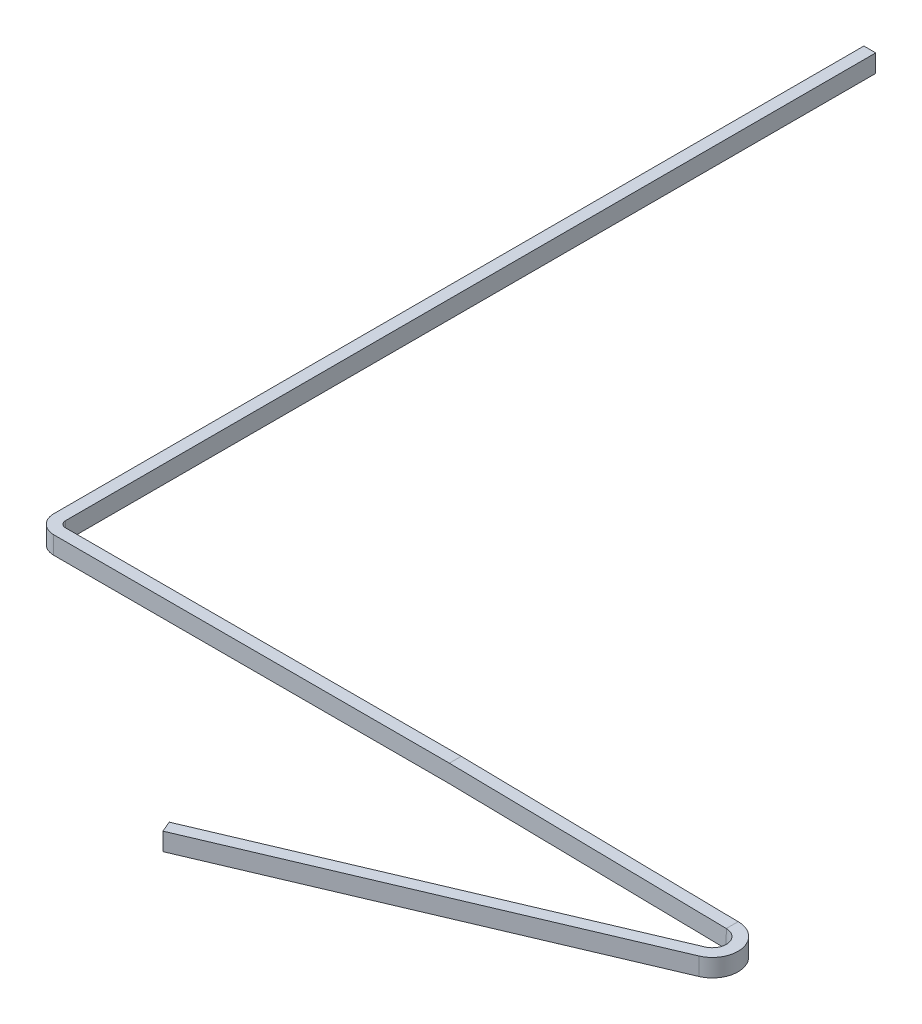
ISO-10303-21;
HEADER;
FILE_DESCRIPTION(('STEP AP214'),'2;1');
FILE_NAME('part.step','',(''),(''),'','','');
FILE_SCHEMA(('AUTOMOTIVE_DESIGN { 1 0 10303 214 1 1 1 1 }'));
ENDSEC;
DATA;
#1=APPLICATION_CONTEXT('core data for automotive mechanical design processes');
#2=APPLICATION_PROTOCOL_DEFINITION('international standard','automotive_design',2000,#1);
#3=PRODUCT_CONTEXT('',#1,'mechanical');
#4=PRODUCT('Part','Part','',(#3));
#5=PRODUCT_RELATED_PRODUCT_CATEGORY('part','',(#4));
#6=PRODUCT_DEFINITION_FORMATION('','',#4);
#7=PRODUCT_DEFINITION_CONTEXT('part definition',#1,'design');
#8=PRODUCT_DEFINITION('design','',#6,#7);
#9=PRODUCT_DEFINITION_SHAPE('','',#8);
#10=(LENGTH_UNIT() NAMED_UNIT(*) SI_UNIT(.MILLI.,.METRE.));
#11=(NAMED_UNIT(*) PLANE_ANGLE_UNIT() SI_UNIT($,.RADIAN.));
#12=(NAMED_UNIT(*) SI_UNIT($,.STERADIAN.) SOLID_ANGLE_UNIT());
#13=UNCERTAINTY_MEASURE_WITH_UNIT(LENGTH_MEASURE(1.E-05),#10,'distance_accuracy_value','');
#14=(GEOMETRIC_REPRESENTATION_CONTEXT(3) GLOBAL_UNCERTAINTY_ASSIGNED_CONTEXT((#13)) GLOBAL_UNIT_ASSIGNED_CONTEXT((#10,
#11,#12)) REPRESENTATION_CONTEXT('',''));
#15=CARTESIAN_POINT('',(0.,0.,0.));
#16=DIRECTION('',(0.,0.,1.));
#17=DIRECTION('',(1.,0.,0.));
#18=AXIS2_PLACEMENT_3D('',#15,#16,#17);
#19=CARTESIAN_POINT('',(0.31,0.225,20.94));
#20=DIRECTION('',(0.,0.,1.));
#21=DIRECTION('',(0.,-1.,0.));
#22=AXIS2_PLACEMENT_3D('',#19,#20,#21);
#23=PLANE('',#22);
#24=DIRECTION('',(1.,0.,0.));
#25=VECTOR('',#24,1.);
#26=CARTESIAN_POINT('',(5.08096421487921,0.225,20.94));
#27=LINE('',#26,#25);
#28=CARTESIAN_POINT('',(0.310000000000003,0.225,20.94));
#29=VERTEX_POINT('',#28);
#30=CARTESIAN_POINT('',(10.3119284297584,0.225,20.94));
#31=VERTEX_POINT('',#30);
#32=EDGE_CURVE('E129',#29,#31,#27,.T.);
#33=ORIENTED_EDGE('',*,*,#32,.F.);
#34=DIRECTION('',(0.,1.,0.));
#35=VECTOR('',#34,1.);
#36=CARTESIAN_POINT('',(0.31,0.,20.94));
#37=LINE('',#36,#35);
#38=CARTESIAN_POINT('',(0.310000000000003,-0.225,20.94));
#39=VERTEX_POINT('',#38);
#40=EDGE_CURVE('E339',#39,#29,#37,.T.);
#41=ORIENTED_EDGE('',*,*,#40,.F.);
#42=DIRECTION('',(-1.,0.,0.));
#43=VECTOR('',#42,1.);
#44=CARTESIAN_POINT('',(5.07903578512079,-0.225,20.94));
#45=LINE('',#44,#43);
#46=CARTESIAN_POINT('',(10.3080715702416,-0.225,20.94));
#47=VERTEX_POINT('',#46);
#48=EDGE_CURVE('E279',#47,#39,#45,.T.);
#49=ORIENTED_EDGE('',*,*,#48,.F.);
#50=DIRECTION('',(-0.999853093603066,0.017140338747481,0.));
#51=VECTOR('',#50,1.);
#52=CARTESIAN_POINT('',(13.8080715702416,-0.285,20.94));
#53=LINE('',#52,#51);
#54=CARTESIAN_POINT('',(17.3080715702661,-0.345,20.9399998717641));
#55=VERTEX_POINT('',#54);
#56=EDGE_CURVE('E147',#55,#47,#53,.T.);
#57=ORIENTED_EDGE('',*,*,#56,.F.);
#58=CARTESIAN_POINT('',(17.3119284105971,0.105,20.9400044651815));
#59=CARTESIAN_POINT('',(17.3117743537489,0.0862499943933692,20.9400038030493));
#60=CARTESIAN_POINT('',(17.3116196248195,0.0674999943004711,20.94000321523));
#61=CARTESIAN_POINT('',(17.3113087689158,0.0299999941146675,20.9400021849687));
#62=CARTESIAN_POINT('',(17.3111526419406,0.0112499940217692,20.9400017425267));
#63=CARTESIAN_POINT('',(17.310838936153,-0.0262500059571002,20.9400009997715));
#64=CARTESIAN_POINT('',(17.3106813573398,-0.0450000058430635,20.9400006994584));
#65=CARTESIAN_POINT('',(17.3103648417196,-0.0825000064493991,20.9400002568678));
#66=CARTESIAN_POINT('',(17.3102059049117,-0.101250007169764,20.9400001145904));
#67=CARTESIAN_POINT('',(17.3098861765729,-0.138750009075973,20.9399999273576));
#68=CARTESIAN_POINT('',(17.3097253850402,-0.157500010261803,20.9399998824023));
#69=CARTESIAN_POINT('',(17.3094011525863,-0.195000011056235,20.9399997749199));
#70=CARTESIAN_POINT('',(17.309237711662,-0.21375001066481,20.9399997123928));
#71=CARTESIAN_POINT('',(17.3089084907849,-0.251250010257553,20.9399995987342));
#72=CARTESIAN_POINT('',(17.3087427108295,-0.270000010241698,20.9399995476026));
#73=CARTESIAN_POINT('',(17.3084088533579,-0.307500010210011,20.9399994507));
#74=CARTESIAN_POINT('',(17.3082407758391,-0.326250010194157,20.939999404929));
#75=CARTESIAN_POINT('',(17.3080715703642,-0.344999999999597,20.9399993588207));
#76=B_SPLINE_CURVE_WITH_KNOTS('',3,(#58,#59,#60,#61,#62,#63,#64,#65,#66,#67,#68,#69,#70,#71,#72,
#73,#74,#75),.UNSPECIFIED.,.F.,.F.,(4,2,2,2,2,2,2,2,4),(0.,0.0562519155002906,0.112503865756662,
0.168755851820885,0.225007874764717,0.281259946448741,0.337512082090783,0.393764280504147,
0.45001654027719),.UNSPECIFIED.);
#77=CARTESIAN_POINT('',(17.3119284239541,0.105,20.940002383193));
#78=VERTEX_POINT('',#77);
#79=EDGE_CURVE('E119',#55,#78,#76,.F.);
#80=ORIENTED_EDGE('',*,*,#79,.T.);
#81=DIRECTION('',(0.999853093603066,-0.017140338747481,0.));
#82=VECTOR('',#81,1.);
#83=CARTESIAN_POINT('',(13.8119284297584,0.165,20.94));
#84=LINE('',#83,#82);
#85=EDGE_CURVE('E148',#31,#78,#84,.T.);
#86=ORIENTED_EDGE('',*,*,#85,.F.);
#87=EDGE_LOOP('',(#33,#41,#49,#57,#80,#86));
#88=FACE_BOUND('',#87,.T.);
#89=ADVANCED_FACE('F15',(#88),#23,.T.);
#90=CARTESIAN_POINT('',(0.310000000000006,-0.27,20.48));
#91=DIRECTION('',(0.,1.,0.));
#92=DIRECTION('',(0.,0.,1.));
#93=AXIS2_PLACEMENT_3D('',#90,#91,#92);
#94=CYLINDRICAL_SURFACE('',#93,0.460000000000002);
#95=CARTESIAN_POINT('',(0.310000000000006,0.225,20.48));
#96=DIRECTION('',(0.,1.,0.));
#97=DIRECTION('',(0.,0.,1.));
#98=AXIS2_PLACEMENT_3D('',#95,#96,#97);
#99=CIRCLE('',#98,0.460000000000002);
#100=CARTESIAN_POINT('',(-0.15,0.225,20.48));
#101=VERTEX_POINT('',#100);
#102=EDGE_CURVE('E19',#101,#29,#99,.T.);
#103=ORIENTED_EDGE('',*,*,#102,.F.);
#104=DIRECTION('',(0.,1.,0.));
#105=VECTOR('',#104,1.);
#106=CARTESIAN_POINT('',(-0.15,0.,20.48));
#107=LINE('',#106,#105);
#108=CARTESIAN_POINT('',(-0.15,-0.225,20.48));
#109=VERTEX_POINT('',#108);
#110=EDGE_CURVE('E96',#109,#101,#107,.T.);
#111=ORIENTED_EDGE('',*,*,#110,.F.);
#112=CARTESIAN_POINT('',(0.310000000000006,-0.225,20.48));
#113=DIRECTION('',(0.,1.,0.));
#114=DIRECTION('',(0.,0.,1.));
#115=AXIS2_PLACEMENT_3D('',#112,#113,#114);
#116=CIRCLE('',#115,0.460000000000002);
#117=EDGE_CURVE('E276',#39,#109,#116,.F.);
#118=ORIENTED_EDGE('',*,*,#117,.F.);
#119=ORIENTED_EDGE('',*,*,#40,.T.);
#120=EDGE_LOOP('',(#103,#111,#118,#119));
#121=FACE_BOUND('',#120,.T.);
#122=ADVANCED_FACE('F364',(#121),#94,.T.);
#123=CARTESIAN_POINT('',(-0.15,0.225,0.));
#124=DIRECTION('',(-1.,0.,0.));
#125=DIRECTION('',(0.,-1.,0.));
#126=AXIS2_PLACEMENT_3D('',#123,#124,#125);
#127=PLANE('',#126);
#128=DIRECTION('',(0.,0.,1.));
#129=VECTOR('',#128,1.);
#130=CARTESIAN_POINT('',(-0.15,0.225,10.47));
#131=LINE('',#130,#129);
#132=CARTESIAN_POINT('',(-0.15,0.225,0.));
#133=VERTEX_POINT('',#132);
#134=EDGE_CURVE('E311',#133,#101,#131,.T.);
#135=ORIENTED_EDGE('',*,*,#134,.F.);
#136=DIRECTION('',(0.,1.,0.));
#137=VECTOR('',#136,1.);
#138=CARTESIAN_POINT('',(-0.15,0.,0.));
#139=LINE('',#138,#137);
#140=CARTESIAN_POINT('',(-0.15,-0.225,0.));
#141=VERTEX_POINT('',#140);
#142=EDGE_CURVE('E108',#141,#133,#139,.T.);
#143=ORIENTED_EDGE('',*,*,#142,.F.);
#144=DIRECTION('',(0.,0.,-1.));
#145=VECTOR('',#144,1.);
#146=CARTESIAN_POINT('',(-0.15,-0.225,10.47));
#147=LINE('',#146,#145);
#148=EDGE_CURVE('E278',#109,#141,#147,.T.);
#149=ORIENTED_EDGE('',*,*,#148,.F.);
#150=ORIENTED_EDGE('',*,*,#110,.T.);
#151=EDGE_LOOP('',(#135,#143,#149,#150));
#152=FACE_BOUND('',#151,.T.);
#153=ADVANCED_FACE('F367',(#152),#127,.T.);
#154=CARTESIAN_POINT('',(0.15,-0.225,0.));
#155=DIRECTION('',(0.,0.,-1.));
#156=DIRECTION('',(-1.,0.,0.));
#157=AXIS2_PLACEMENT_3D('',#154,#155,#156);
#158=PLANE('',#157);
#159=ORIENTED_EDGE('',*,*,#142,.T.);
#160=DIRECTION('',(-1.,0.,0.));
#161=VECTOR('',#160,1.);
#162=CARTESIAN_POINT('',(5.08096421487921,0.225,0.));
#163=LINE('',#162,#161);
#164=CARTESIAN_POINT('',(0.150000000000008,0.225,0.));
#165=VERTEX_POINT('',#164);
#166=EDGE_CURVE('E314',#165,#133,#163,.T.);
#167=ORIENTED_EDGE('',*,*,#166,.F.);
#168=DIRECTION('',(0.,1.,0.));
#169=VECTOR('',#168,1.);
#170=CARTESIAN_POINT('',(0.15,0.,0.));
#171=LINE('',#170,#169);
#172=CARTESIAN_POINT('',(0.149999999999974,-0.225,0.));
#173=VERTEX_POINT('',#172);
#174=EDGE_CURVE('E323',#173,#165,#171,.T.);
#175=ORIENTED_EDGE('',*,*,#174,.F.);
#176=DIRECTION('',(1.,0.,0.));
#177=VECTOR('',#176,1.);
#178=CARTESIAN_POINT('',(5.07903578512079,-0.225,0.));
#179=LINE('',#178,#177);
#180=EDGE_CURVE('E284',#141,#173,#179,.T.);
#181=ORIENTED_EDGE('',*,*,#180,.F.);
#182=EDGE_LOOP('',(#159,#167,#175,#181));
#183=FACE_BOUND('',#182,.T.);
#184=ADVANCED_FACE('F371',(#183),#158,.T.);
#185=CARTESIAN_POINT('',(0.15,-0.225,0.));
#186=DIRECTION('',(1.,0.,0.));
#187=DIRECTION('',(0.,1.,0.));
#188=AXIS2_PLACEMENT_3D('',#185,#186,#187);
#189=PLANE('',#188);
#190=ORIENTED_EDGE('',*,*,#174,.T.);
#191=DIRECTION('',(0.,0.,-1.));
#192=VECTOR('',#191,1.);
#193=CARTESIAN_POINT('',(0.150000000000012,0.225,10.47));
#194=LINE('',#193,#192);
#195=CARTESIAN_POINT('',(0.150000000000006,0.225,20.48));
#196=VERTEX_POINT('',#195);
#197=EDGE_CURVE('E317',#196,#165,#194,.T.);
#198=ORIENTED_EDGE('',*,*,#197,.F.);
#199=DIRECTION('',(0.,-1.,0.));
#200=VECTOR('',#199,1.);
#201=CARTESIAN_POINT('',(0.15,0.,20.48));
#202=LINE('',#201,#200);
#203=CARTESIAN_POINT('',(0.149999999999981,-0.225,20.48));
#204=VERTEX_POINT('',#203);
#205=EDGE_CURVE('E326',#196,#204,#202,.T.);
#206=ORIENTED_EDGE('',*,*,#205,.T.);
#207=DIRECTION('',(0.,0.,1.));
#208=VECTOR('',#207,1.);
#209=CARTESIAN_POINT('',(0.149999999999962,-0.225,10.47));
#210=LINE('',#209,#208);
#211=EDGE_CURVE('E275',#173,#204,#210,.T.);
#212=ORIENTED_EDGE('',*,*,#211,.F.);
#213=EDGE_LOOP('',(#190,#198,#206,#212));
#214=FACE_BOUND('',#213,.T.);
#215=ADVANCED_FACE('F374',(#214),#189,.T.);
#216=CARTESIAN_POINT('',(-0.15,0.225,0.));
#217=DIRECTION('',(0.,1.,0.));
#218=DIRECTION('',(0.,0.,1.));
#219=AXIS2_PLACEMENT_3D('',#216,#217,#218);
#220=PLANE('',#219);
#221=ORIENTED_EDGE('',*,*,#134,.T.);
#222=ORIENTED_EDGE('',*,*,#102,.T.);
#223=ORIENTED_EDGE('',*,*,#32,.T.);
#224=DIRECTION('',(0.,0.,1.));
#225=VECTOR('',#224,1.);
#226=CARTESIAN_POINT('',(10.3119284297584,0.225,20.79));
#227=LINE('',#226,#225);
#228=CARTESIAN_POINT('',(10.3119284297584,0.225,20.64));
#229=VERTEX_POINT('',#228);
#230=EDGE_CURVE('E303',#229,#31,#227,.T.);
#231=ORIENTED_EDGE('',*,*,#230,.F.);
#232=DIRECTION('',(1.,0.,0.));
#233=VECTOR('',#232,1.);
#234=CARTESIAN_POINT('',(8.81096421487923,0.225,20.64));
#235=LINE('',#234,#233);
#236=CARTESIAN_POINT('',(0.31,0.225,20.64));
#237=VERTEX_POINT('',#236);
#238=EDGE_CURVE('E267',#237,#229,#235,.T.);
#239=ORIENTED_EDGE('',*,*,#238,.F.);
#240=CARTESIAN_POINT('',(0.31,0.225,20.48));
#241=DIRECTION('',(0.,1.,0.));
#242=DIRECTION('',(0.,0.,1.));
#243=AXIS2_PLACEMENT_3D('',#240,#241,#242);
#244=CIRCLE('',#243,0.160000000000002);
#245=EDGE_CURVE('E270',#196,#237,#244,.T.);
#246=ORIENTED_EDGE('',*,*,#245,.F.);
#247=ORIENTED_EDGE('',*,*,#197,.T.);
#248=ORIENTED_EDGE('',*,*,#166,.T.);
#249=EDGE_LOOP('',(#221,#222,#223,#231,#239,#246,#247,#248));
#250=FACE_BOUND('',#249,.T.);
#251=ADVANCED_FACE('F377',(#250),#220,.T.);
#252=CARTESIAN_POINT('',(17.3119284297585,0.105,20.64));
#253=DIRECTION('',(0.017140338747481,0.999853093603066,0.));
#254=DIRECTION('',(-0.999853093603066,0.017140338747481,0.));
#255=AXIS2_PLACEMENT_3D('',#252,#253,#254);
#256=PLANE('',#255);
#257=ORIENTED_EDGE('',*,*,#230,.T.);
#258=ORIENTED_EDGE('',*,*,#85,.T.);
#259=DIRECTION('',(0.,0.,-1.));
#260=VECTOR('',#259,1.);
#261=CARTESIAN_POINT('',(17.3119284297585,0.105,20.79));
#262=LINE('',#261,#260);
#263=CARTESIAN_POINT('',(17.3119284213291,0.105000000000001,20.6400021728676));
#264=VERTEX_POINT('',#263);
#265=EDGE_CURVE('E301',#78,#264,#262,.T.);
#266=ORIENTED_EDGE('',*,*,#265,.T.);
#267=DIRECTION('',(0.999853093603066,-0.0171403387474805,0.));
#268=VECTOR('',#267,1.);
#269=CARTESIAN_POINT('',(10.3119284297583,0.225,20.64));
#270=LINE('',#269,#268);
#271=EDGE_CURVE('E160',#229,#264,#270,.T.);
#272=ORIENTED_EDGE('',*,*,#271,.F.);
#273=EDGE_LOOP('',(#257,#258,#266,#272));
#274=FACE_BOUND('',#273,.T.);
#275=ADVANCED_FACE('F381',(#274),#256,.T.);
#276=CARTESIAN_POINT('',(10.3080715702416,-0.225,20.64));
#277=DIRECTION('',(-0.017140338747481,-0.999853093603066,0.));
#278=DIRECTION('',(0.999853093603066,-0.017140338747481,0.));
#279=AXIS2_PLACEMENT_3D('',#276,#277,#278);
#280=PLANE('',#279);
#281=ORIENTED_EDGE('',*,*,#56,.T.);
#282=DIRECTION('',(0.,0.,1.));
#283=VECTOR('',#282,1.);
#284=CARTESIAN_POINT('',(10.3080715702416,-0.225,10.47));
#285=LINE('',#284,#283);
#286=CARTESIAN_POINT('',(10.3080715702426,-0.22500000000001,20.64));
#287=VERTEX_POINT('',#286);
#288=EDGE_CURVE('E155',#287,#47,#285,.T.);
#289=ORIENTED_EDGE('',*,*,#288,.F.);
#290=DIRECTION('',(-0.999853093603066,0.017140338747481,0.));
#291=VECTOR('',#290,1.);
#292=CARTESIAN_POINT('',(17.3080715702416,-0.345,20.64));
#293=LINE('',#292,#291);
#294=CARTESIAN_POINT('',(17.3080715703353,-0.345,20.639999807439));
#295=VERTEX_POINT('',#294);
#296=EDGE_CURVE('E151',#295,#287,#293,.T.);
#297=ORIENTED_EDGE('',*,*,#296,.F.);
#298=DIRECTION('',(0.,0.,1.));
#299=VECTOR('',#298,1.);
#300=CARTESIAN_POINT('',(17.3080715702416,-0.345,20.79));
#301=LINE('',#300,#299);
#302=EDGE_CURVE('E138',#295,#55,#301,.T.);
#303=ORIENTED_EDGE('',*,*,#302,.T.);
#304=EDGE_LOOP('',(#281,#289,#297,#303));
#305=FACE_BOUND('',#304,.T.);
#306=ADVANCED_FACE('F153',(#305),#280,.T.);
#307=CARTESIAN_POINT('',(-0.15,-0.225,20.94));
#308=DIRECTION('',(0.,-1.,0.));
#309=DIRECTION('',(0.,0.,-1.));
#310=AXIS2_PLACEMENT_3D('',#307,#308,#309);
#311=PLANE('',#310);
#312=ORIENTED_EDGE('',*,*,#211,.T.);
#313=CARTESIAN_POINT('',(0.31,-0.225,20.48));
#314=DIRECTION('',(0.,1.,0.));
#315=DIRECTION('',(0.,0.,1.));
#316=AXIS2_PLACEMENT_3D('',#313,#314,#315);
#317=CIRCLE('',#316,0.160000000000002);
#318=CARTESIAN_POINT('',(0.31,-0.225000000000001,20.64));
#319=VERTEX_POINT('',#318);
#320=EDGE_CURVE('E273',#319,#204,#317,.F.);
#321=ORIENTED_EDGE('',*,*,#320,.F.);
#322=DIRECTION('',(-1.,0.,0.));
#323=VECTOR('',#322,1.);
#324=CARTESIAN_POINT('',(8.81096421487923,-0.225000000000002,20.64));
#325=LINE('',#324,#323);
#326=EDGE_CURVE('E159',#287,#319,#325,.T.);
#327=ORIENTED_EDGE('',*,*,#326,.F.);
#328=ORIENTED_EDGE('',*,*,#288,.T.);
#329=ORIENTED_EDGE('',*,*,#48,.T.);
#330=ORIENTED_EDGE('',*,*,#117,.T.);
#331=ORIENTED_EDGE('',*,*,#148,.T.);
#332=ORIENTED_EDGE('',*,*,#180,.T.);
#333=EDGE_LOOP('',(#312,#321,#327,#328,#329,#330,#331,#332));
#334=FACE_BOUND('',#333,.T.);
#335=ADVANCED_FACE('F387',(#334),#311,.T.);
#336=CARTESIAN_POINT('',(0.31,-0.27,20.48));
#337=DIRECTION('',(0.,1.,0.));
#338=DIRECTION('',(0.,0.,1.));
#339=AXIS2_PLACEMENT_3D('',#336,#337,#338);
#340=CYLINDRICAL_SURFACE('',#339,0.160000000000002);
#341=ORIENTED_EDGE('',*,*,#205,.F.);
#342=ORIENTED_EDGE('',*,*,#245,.T.);
#343=DIRECTION('',(0.,1.,0.));
#344=VECTOR('',#343,1.);
#345=CARTESIAN_POINT('',(0.31,-0.06,20.64));
#346=LINE('',#345,#344);
#347=EDGE_CURVE('E262',#319,#237,#346,.T.);
#348=ORIENTED_EDGE('',*,*,#347,.F.);
#349=ORIENTED_EDGE('',*,*,#320,.T.);
#350=EDGE_LOOP('',(#341,#342,#348,#349));
#351=FACE_BOUND('',#350,.T.);
#352=ADVANCED_FACE('F389',(#351),#340,.F.);
#353=CARTESIAN_POINT('',(0.31,-0.345,20.64));
#354=DIRECTION('',(0.,0.,-1.));
#355=DIRECTION('',(0.,1.,0.));
#356=AXIS2_PLACEMENT_3D('',#353,#354,#355);
#357=PLANE('',#356);
#358=ORIENTED_EDGE('',*,*,#326,.T.);
#359=ORIENTED_EDGE('',*,*,#347,.T.);
#360=ORIENTED_EDGE('',*,*,#238,.T.);
#361=ORIENTED_EDGE('',*,*,#271,.T.);
#362=CARTESIAN_POINT('',(17.30807157071,-0.345000000000424,20.6399990371949));
#363=CARTESIAN_POINT('',(17.3082274375949,-0.326249994605904,20.6399991060643));
#364=CARTESIAN_POINT('',(17.3083839483517,-0.30749999456338,20.6399991757276));
#365=CARTESIAN_POINT('',(17.3086982773589,-0.269999994478325,20.6399993207202));
#366=CARTESIAN_POINT('',(17.30885609561,-0.2512499944358,20.6399993960496));
#367=CARTESIAN_POINT('',(17.3091730592695,-0.213749994211016,20.6399995564527));
#368=CARTESIAN_POINT('',(17.3093322046787,-0.194999994028763,20.6399996415264));
#369=CARTESIAN_POINT('',(17.3096519389818,-0.157499994215478,20.6399998019571));
#370=CARTESIAN_POINT('',(17.3098125278766,-0.138749994584453,20.6399998773141));
#371=CARTESIAN_POINT('',(17.3101348788019,-0.101249995597637,20.6400000930074));
#372=CARTESIAN_POINT('',(17.3102966408329,-0.0824999962418498,20.6400002333436));
#373=CARTESIAN_POINT('',(17.3106208847731,-0.0449999967332675,20.6400006863309));
#374=CARTESIAN_POINT('',(17.3107833666825,-0.0262499965804743,20.6400009989821));
#375=CARTESIAN_POINT('',(17.311109152767,0.0112500035273575,20.6400017687428));
#376=CARTESIAN_POINT('',(17.3112724569424,0.0300000034823934,20.6400022258524));
#377=CARTESIAN_POINT('',(17.3115998523538,0.0675000033924677,20.6400032901527));
#378=CARTESIAN_POINT('',(17.3117639435902,0.0862500033475036,20.6400038973435));
#379=CARTESIAN_POINT('',(17.3119284107245,0.105,20.6400045823863));
#380=B_SPLINE_CURVE_WITH_KNOTS('',3,(#362,#363,#364,#365,#366,#367,#368,#369,#370,#371,#372,
#373,#374,#375,#376,#377,#378,#379),.UNSPECIFIED.,.F.,.F.,(4,2,2,2,2,2,2,2,4),(0.,
0.0562519596977172,0.112503952273703,0.168755978912368,0.225008040821186,0.281260132186096,
0.337512244627396,0.393764377910769,0.450016531819829),.UNSPECIFIED.);
#381=EDGE_CURVE('E164',#295,#264,#380,.T.);
#382=ORIENTED_EDGE('',*,*,#381,.F.);
#383=ORIENTED_EDGE('',*,*,#296,.T.);
#384=EDGE_LOOP('',(#358,#359,#360,#361,#382,#383));
#385=FACE_BOUND('',#384,.T.);
#386=ADVANCED_FACE('F166',(#385),#357,.T.);
#387=CARTESIAN_POINT('',(7.88116105055751,0.105,20.6082717011431));
#388=DIRECTION('',(0.,1.,0.));
#389=DIRECTION('',(0.,0.,1.));
#390=AXIS2_PLACEMENT_3D('',#387,#388,#389);
#391=PLANE('',#390);
#392=ORIENTED_EDGE('',*,*,#265,.F.);
#393=CARTESIAN_POINT('',(17.3119284150195,0.105,20.9400044652005));
#394=CARTESIAN_POINT('',(17.3315696168396,0.105,20.9401172998828));
#395=CARTESIAN_POINT('',(17.3511527689535,0.105,20.9418791003449));
#396=CARTESIAN_POINT('',(17.3897523942873,0.105,20.9486414323797));
#397=CARTESIAN_POINT('',(17.4087688311586,0.105,20.9536421712295));
#398=CARTESIAN_POINT('',(17.4641486064081,0.105,20.9733638885732));
#399=CARTESIAN_POINT('',(17.4989974814422,0.105,20.992806205921));
#400=CARTESIAN_POINT('',(17.5448236869837,0.105,21.0297306830698));
#401=CARTESIAN_POINT('',(17.5590645923039,0.105,21.0433965697079));
#402=CARTESIAN_POINT('',(17.5850688967011,0.105,21.072925657451));
#403=CARTESIAN_POINT('',(17.5968302569103,0.105,21.0887906491968));
#404=CARTESIAN_POINT('',(17.6278835133235,0.105,21.1388867530479));
#405=CARTESIAN_POINT('',(17.6431406743221,0.105,21.17578193115));
#406=CARTESIAN_POINT('',(17.6602483798876,0.105,21.2526457717365));
#407=CARTESIAN_POINT('',(17.6620353063158,0.105,21.2926281189013));
#408=CARTESIAN_POINT('',(17.6525762783553,0.105,21.3708089804649));
#409=CARTESIAN_POINT('',(17.6414211897467,0.105,21.4090179964898));
#410=CARTESIAN_POINT('',(17.615532867868,0.105,21.4618940518058));
#411=CARTESIAN_POINT('',(17.6052921835749,0.105,21.4788638212651));
#412=CARTESIAN_POINT('',(17.5820775264365,0.105,21.5108586087967));
#413=CARTESIAN_POINT('',(17.5691002157083,0.105,21.5258812154368));
#414=CARTESIAN_POINT('',(17.5393935508425,0.105,21.5549869508548));
#415=CARTESIAN_POINT('',(17.5224165435388,0.105,21.5688181001388));
#416=CARTESIAN_POINT('',(17.4862091295674,0.105,21.5931169635828));
#417=CARTESIAN_POINT('',(17.4669786837483,0.105,21.6035846192933));
#418=CARTESIAN_POINT('',(17.4468982813718,0.105,21.6121162221271));
#419=B_SPLINE_CURVE_WITH_KNOTS('',3,(#393,#394,#395,#396,#397,#398,#399,#400,#401,#402,#403,
#404,#405,#406,#407,#408,#409,#410,#411,#412,#413,#414,#415,#416,#417,#418),.UNSPECIFIED.,.F.,
.F.,(4,2,2,2,2,2,2,2,2,2,2,2,4),(0.,0.0587590682131911,0.117521897107272,0.234603962040517,
0.293576912258542,0.352598166933739,0.469910337617659,0.587776213124625,0.704819535853595,
0.764021795764862,0.823296687127429,0.88861550839168,0.953935464679023),.UNSPECIFIED.);
#420=CARTESIAN_POINT('',(17.4468982813718,0.105,21.6121162221271));
#421=VERTEX_POINT('',#420);
#422=EDGE_CURVE('E173',#78,#421,#419,.T.);
#423=ORIENTED_EDGE('',*,*,#422,.T.);
#424=DIRECTION('',(0.920332063220277,0.,-0.391137946776719));
#425=VECTOR('',#424,1.);
#426=CARTESIAN_POINT('',(12.6941137946777,0.105,23.632033206322));
#427=LINE('',#426,#425);
#428=CARTESIAN_POINT('',(7.94132930798349,0.105,25.651950190517));
#429=VERTEX_POINT('',#428);
#430=EDGE_CURVE('E183',#429,#421,#427,.T.);
#431=ORIENTED_EDGE('',*,*,#430,.F.);
#432=DIRECTION('',(0.3911379467768,0.,0.920332063220243));
#433=VECTOR('',#432,1.);
#434=CARTESIAN_POINT('',(7.94132930798348,0.105,25.6519501905169));
#435=LINE('',#434,#433);
#436=CARTESIAN_POINT('',(8.05867069201651,0.105,25.928049809483));
#437=VERTEX_POINT('',#436);
#438=EDGE_CURVE('E260',#429,#437,#435,.T.);
#439=ORIENTED_EDGE('',*,*,#438,.T.);
#440=DIRECTION('',(-0.920332063220278,0.,0.391137946776717));
#441=VECTOR('',#440,1.);
#442=CARTESIAN_POINT('',(12.8114551787107,0.105,23.9081328252881));
#443=LINE('',#442,#441);
#444=CARTESIAN_POINT('',(17.5642396654048,0.105,21.8882158410932));
#445=VERTEX_POINT('',#444);
#446=EDGE_CURVE('E574',#445,#437,#443,.T.);
#447=ORIENTED_EDGE('',*,*,#446,.F.);
#448=CARTESIAN_POINT('',(17.3119284113206,0.105,20.6400045823888));
#449=CARTESIAN_POINT('',(17.3502846841378,0.105,20.6401216194662));
#450=CARTESIAN_POINT('',(17.3885297988465,0.105,20.6436333733859));
#451=CARTESIAN_POINT('',(17.4638013683684,0.105,20.6572958861493));
#452=CARTESIAN_POINT('',(17.5008282173929,0.105,20.6674444747818));
#453=CARTESIAN_POINT('',(17.6053650723682,0.105,20.7064081524103));
#454=CARTESIAN_POINT('',(17.6699803191154,0.105,20.7438055586286));
#455=CARTESIAN_POINT('',(17.7542424499762,0.105,20.8141277356135));
#456=CARTESIAN_POINT('',(17.7802135615901,0.105,20.839929186321));
#457=CARTESIAN_POINT('',(17.827537673513,0.105,20.895550578366));
#458=CARTESIAN_POINT('',(17.8488867707716,0.105,20.92537388173));
#459=CARTESIAN_POINT('',(17.8863965662344,0.105,20.9881278370312));
#460=CARTESIAN_POINT('',(17.9025555612801,0.105,21.0210595044162));
#461=CARTESIAN_POINT('',(17.9291621822399,0.105,21.0891664954159));
#462=CARTESIAN_POINT('',(17.9396064412198,0.105,21.1243431280928));
#463=CARTESIAN_POINT('',(17.961457387885,0.105,21.2316480122661));
#464=CARTESIAN_POINT('',(17.9635545959058,0.105,21.3058388232613));
#465=CARTESIAN_POINT('',(17.9436407093435,0.105,21.4508117871923));
#466=CARTESIAN_POINT('',(17.9216588261724,0.105,21.5215979618007));
#467=CARTESIAN_POINT('',(17.8717920547054,0.105,21.6190092968081));
#468=CARTESIAN_POINT('',(17.8522711046826,0.105,21.6500972609011));
#469=CARTESIAN_POINT('',(17.8082689604074,0.105,21.7086095560262));
#470=CARTESIAN_POINT('',(17.7837821092351,0.105,21.7360296491371));
#471=CARTESIAN_POINT('',(17.7291120157085,0.105,21.7878824237102));
#472=CARTESIAN_POINT('',(17.698684942883,0.105,21.812058467544));
#473=CARTESIAN_POINT('',(17.634064008166,0.105,21.8546534992457));
#474=CARTESIAN_POINT('',(17.5998718708655,0.105,21.8730751082234));
#475=CARTESIAN_POINT('',(17.5642396654048,0.105,21.8882158410932));
#476=B_SPLINE_CURVE_WITH_KNOTS('',3,(#448,#449,#450,#451,#452,#453,#454,#455,#456,#457,#458,
#459,#460,#461,#462,#463,#464,#465,#466,#467,#468,#469,#470,#471,#472,#473,#474,#475),
.UNSPECIFIED.,.F.,.F.,(4,2,2,2,2,2,2,2,2,2,2,2,2,4),(0.,0.114721283687776,0.229405072843444,
0.448365585222112,0.557777458866369,0.667281367845412,0.776821174460554,0.88642544901791,
1.10468163910317,1.32267334587981,1.43231986173727,1.54209199049948,1.65807196238512,
1.77399902881096),.UNSPECIFIED.);
#477=EDGE_CURVE('E172',#264,#445,#476,.T.);
#478=ORIENTED_EDGE('',*,*,#477,.F.);
#479=EDGE_LOOP('',(#392,#423,#431,#439,#447,#478));
#480=FACE_BOUND('',#479,.T.);
#481=ADVANCED_FACE('F247',(#480),#391,.T.);
#482=CARTESIAN_POINT('',(17.2995100109884,-0.345,20.6399976561802));
#483=CARTESIAN_POINT('',(17.3027683249437,-0.345,20.6399974045571));
#484=CARTESIAN_POINT('',(17.3061862095368,-0.345,20.6399978444406));
#485=CARTESIAN_POINT('',(17.326436507925,-0.345,20.640009289936));
#486=CARTESIAN_POINT('',(17.3471458173897,-0.345,20.6407969043451));
#487=CARTESIAN_POINT('',(17.3841294709313,-0.345,20.6439742316277));
#488=CARTESIAN_POINT('',(17.4025478603346,-0.345,20.6463548072916));
#489=CARTESIAN_POINT('',(17.4573939468906,-0.345,20.6558454549112));
#490=CARTESIAN_POINT('',(17.4934127070211,-0.345,20.6653110538417));
#491=CARTESIAN_POINT('',(17.5982479797767,-0.345,20.702701859721));
#492=CARTESIAN_POINT('',(17.6637377753225,-0.345,20.7396590001917));
#493=CARTESIAN_POINT('',(17.8361329730039,-0.345,20.8804800229327));
#494=CARTESIAN_POINT('',(17.9173040391961,-0.345,21.014855668627));
#495=CARTESIAN_POINT('',(17.9765407682358,-0.345,21.3056844952156));
#496=CARTESIAN_POINT('',(17.9543959758246,-0.345,21.4611035518385));
#497=CARTESIAN_POINT('',(17.8162885429449,-0.345,21.7238139121712));
#498=CARTESIAN_POINT('',(17.7010198903513,-0.345,21.8300847181179));
#499=CARTESIAN_POINT('',(17.5642396654048,-0.345,21.8882158410932));
#500=CARTESIAN_POINT('',(17.2995100109884,0.105,20.6399976561802));
#501=CARTESIAN_POINT('',(17.3027683249437,0.105,20.6399974045571));
#502=CARTESIAN_POINT('',(17.3061862095368,0.105,20.6399978444406));
#503=CARTESIAN_POINT('',(17.326436507925,0.105,20.640009289936));
#504=CARTESIAN_POINT('',(17.3471458173897,0.105,20.6407969043451));
#505=CARTESIAN_POINT('',(17.3841294709313,0.105,20.6439742316277));
#506=CARTESIAN_POINT('',(17.4025478603346,0.105,20.6463548072916));
#507=CARTESIAN_POINT('',(17.4573939468906,0.105,20.6558454549112));
#508=CARTESIAN_POINT('',(17.4934127070211,0.105,20.6653110538417));
#509=CARTESIAN_POINT('',(17.5982479797767,0.105,20.702701859721));
#510=CARTESIAN_POINT('',(17.6637377753225,0.105,20.7396590001917));
#511=CARTESIAN_POINT('',(17.8361329730039,0.105,20.8804800229327));
#512=CARTESIAN_POINT('',(17.9173040391961,0.105,21.014855668627));
#513=CARTESIAN_POINT('',(17.9765407682358,0.105,21.3056844952156));
#514=CARTESIAN_POINT('',(17.9543959758246,0.105,21.4611035518385));
#515=CARTESIAN_POINT('',(17.8162885429449,0.105,21.7238139121712));
#516=CARTESIAN_POINT('',(17.7010198903513,0.105,21.8300847181179));
#517=CARTESIAN_POINT('',(17.5642396654048,0.105,21.8882158410932));
#518=B_SPLINE_SURFACE_WITH_KNOTS('',1,3,((#482,#483,#484,#485,#486,#487,#488,#489,#490,#491,
#492,#493,#494,#495,#496,#497,#498,#499),(#500,#501,#502,#503,#504,#505,#506,#507,#508,#509,
#510,#511,#512,#513,#514,#515,#516,#517)),.UNSPECIFIED.,.F.,.F.,.F.,(2,2),(4,2,2,2,2,2,2,2,4),
(0.,1.),(-0.00084908749806,0.,0.00365936029408,0.00731872058815,0.0146374411763,
0.02927488235261,0.05854976470521,0.08782464705782,0.11709952941042),.UNSPECIFIED.);
#519=CARTESIAN_POINT('',(17.3100000000228,-0.345,20.64));
#520=CARTESIAN_POINT('',(17.3483606594796,-0.345,20.6400043187612));
#521=CARTESIAN_POINT('',(17.3866209385389,-0.345,20.6434038848509));
#522=CARTESIAN_POINT('',(17.4619415597631,-0.345,20.6568465049339));
#523=CARTESIAN_POINT('',(17.4990023087965,-0.345,20.6668872809918));
#524=CARTESIAN_POINT('',(17.6035320283064,-0.345,20.705500401089));
#525=CARTESIAN_POINT('',(17.6681440252148,-0.345,20.7426203853372));
#526=CARTESIAN_POINT('',(17.7525656869575,-0.345,20.8125639201296));
#527=CARTESIAN_POINT('',(17.7786383891321,-0.345,20.8382803707388));
#528=CARTESIAN_POINT('',(17.8261720771937,-0.345,20.8937547333624));
#529=CARTESIAN_POINT('',(17.8476291528626,-0.345,20.9235160374993));
#530=CARTESIAN_POINT('',(17.8853439325134,-0.345,20.9861354728054));
#531=CARTESIAN_POINT('',(17.9016047914682,-0.345,21.0189917090804));
#532=CARTESIAN_POINT('',(17.9284359322028,-0.345,21.0869629086078));
#533=CARTESIAN_POINT('',(17.9390028885574,-0.345,21.1220791784218));
#534=CARTESIAN_POINT('',(17.9612540661699,-0.345,21.2293255295738));
#535=CARTESIAN_POINT('',(17.9636128932801,-0.345,21.3035587484692));
#536=CARTESIAN_POINT('',(17.9441916893164,-0.345,21.4485985844356));
#537=CARTESIAN_POINT('',(17.922470991551,-0.345,21.5194131774022));
#538=CARTESIAN_POINT('',(17.8729741327957,-0.345,21.6169868626553));
#539=CARTESIAN_POINT('',(17.853556291538,-0.345,21.6481653519264));
#540=CARTESIAN_POINT('',(17.8097359898625,-0.345,21.7068684213491));
#541=CARTESIAN_POINT('',(17.785327750554,-0.345,21.7343887037657));
#542=CARTESIAN_POINT('',(17.7305486134938,-0.345,21.7866956558211));
#543=CARTESIAN_POINT('',(17.6998905989805,-0.345,21.811182252493));
#544=CARTESIAN_POINT('',(17.634723418549,-0.345,21.8542980704152));
#545=CARTESIAN_POINT('',(17.6002156647684,-0.345,21.8729294299378));
#546=CARTESIAN_POINT('',(17.5642396654048,-0.345,21.8882158410932));
#547=B_SPLINE_CURVE_WITH_KNOTS('',3,(#519,#520,#521,#522,#523,#524,#525,#526,#527,#528,#529,
#530,#531,#532,#533,#534,#535,#536,#537,#538,#539,#540,#541,#542,#543,#544,#545,#546),
.UNSPECIFIED.,.F.,.F.,(4,2,2,2,2,2,2,2,2,2,2,2,2,4),(0.,0.114735445989018,0.229431558106038,
0.447998711035285,0.557446763102453,0.666987174209726,0.776460949028038,0.885998591002501,
1.10439143494043,1.32224734031119,1.43195857758808,1.54179758767038,1.6588821100994,
1.77592382464842),.UNSPECIFIED.);
#548=CARTESIAN_POINT('',(17.3100000000228,-0.345,20.64));
#549=VERTEX_POINT('',#548);
#550=CARTESIAN_POINT('',(17.5642396654049,-0.345,21.8882158410932));
#551=VERTEX_POINT('',#550);
#552=EDGE_CURVE('E177',#549,#551,#547,.T.);
#553=DIRECTION('',(1.,0.,0.));
#554=VECTOR('',#553,1.);
#555=CARTESIAN_POINT('',(12.9513745961773,-0.345,20.64));
#556=LINE('',#555,#554);
#557=EDGE_CURVE('E144',#295,#549,#556,.T.);
#558=DIRECTION('',(0.,1.,0.));
#559=VECTOR('',#558,1.);
#560=CARTESIAN_POINT('',(17.5642396654048,-0.12,21.8882158410932));
#561=LINE('',#560,#559);
#562=EDGE_CURVE('E572',#551,#445,#561,.T.);
#563=ORIENTED_EDGE('',*,*,#552,.F.);
#564=ORIENTED_EDGE('',*,*,#557,.F.);
#565=ORIENTED_EDGE('',*,*,#381,.T.);
#566=ORIENTED_EDGE('',*,*,#477,.T.);
#567=ORIENTED_EDGE('',*,*,#562,.F.);
#568=EDGE_LOOP('',(#563,#564,#565,#566,#567));
#569=FACE_BOUND('',#568,.T.);
#570=ADVANCED_FACE('F176',(#569),#518,.T.);
#571=CARTESIAN_POINT('',(8.0586706920165,-0.345,25.928049809483));
#572=DIRECTION('',(0.391137946776717,0.,0.920332063220278));
#573=DIRECTION('',(0.920332063220278,0.,-0.391137946776717));
#574=AXIS2_PLACEMENT_3D('',#571,#572,#573);
#575=PLANE('',#574);
#576=ORIENTED_EDGE('',*,*,#562,.T.);
#577=ORIENTED_EDGE('',*,*,#446,.T.);
#578=DIRECTION('',(0.,-1.,0.));
#579=VECTOR('',#578,1.);
#580=CARTESIAN_POINT('',(8.0586706920165,-0.12,25.928049809483));
#581=LINE('',#580,#579);
#582=CARTESIAN_POINT('',(8.05867069201649,-0.345,25.928049809483));
#583=VERTEX_POINT('',#582);
#584=EDGE_CURVE('E240',#437,#583,#581,.T.);
#585=ORIENTED_EDGE('',*,*,#584,.T.);
#586=DIRECTION('',(-0.920332063220279,0.,0.391137946776714));
#587=VECTOR('',#586,1.);
#588=CARTESIAN_POINT('',(17.5642396654049,-0.345,21.8882158410932));
#589=LINE('',#588,#587);
#590=EDGE_CURVE('E180',#551,#583,#589,.T.);
#591=ORIENTED_EDGE('',*,*,#590,.F.);
#592=EDGE_LOOP('',(#576,#577,#585,#591));
#593=FACE_BOUND('',#592,.T.);
#594=ADVANCED_FACE('F253',(#593),#575,.T.);
#595=CARTESIAN_POINT('',(17.4468982813718,-0.345,21.6121162221271));
#596=DIRECTION('',(-0.39113794677672,0.,-0.920332063220277));
#597=DIRECTION('',(-0.920332063220277,0.,0.39113794677672));
#598=AXIS2_PLACEMENT_3D('',#595,#596,#597);
#599=PLANE('',#598);
#600=ORIENTED_EDGE('',*,*,#430,.T.);
#601=DIRECTION('',(0.,1.,0.));
#602=VECTOR('',#601,1.);
#603=CARTESIAN_POINT('',(17.4468982813718,-0.12,21.6121162221271));
#604=LINE('',#603,#602);
#605=CARTESIAN_POINT('',(17.4468982813718,-0.345,21.6121162221271));
#606=VERTEX_POINT('',#605);
#607=EDGE_CURVE('E178',#606,#421,#604,.T.);
#608=ORIENTED_EDGE('',*,*,#607,.F.);
#609=DIRECTION('',(0.920332063220278,0.,-0.391137946776718));
#610=VECTOR('',#609,1.);
#611=CARTESIAN_POINT('',(7.94132930798348,-0.345,25.651950190517));
#612=LINE('',#611,#610);
#613=CARTESIAN_POINT('',(7.94132930798348,-0.345,25.651950190517));
#614=VERTEX_POINT('',#613);
#615=EDGE_CURVE('E225',#614,#606,#612,.T.);
#616=ORIENTED_EDGE('',*,*,#615,.F.);
#617=DIRECTION('',(0.,1.,0.));
#618=VECTOR('',#617,1.);
#619=CARTESIAN_POINT('',(7.94132930798349,-0.12,25.651950190517));
#620=LINE('',#619,#618);
#621=EDGE_CURVE('E33',#614,#429,#620,.T.);
#622=ORIENTED_EDGE('',*,*,#621,.T.);
#623=EDGE_LOOP('',(#600,#608,#616,#622));
#624=FACE_BOUND('',#623,.T.);
#625=ADVANCED_FACE('F206',(#624),#599,.T.);
#626=CARTESIAN_POINT('',(17.3000818887231,0.105,20.9399987611204));
#627=CARTESIAN_POINT('',(17.3036421335358,0.105,20.939998580981));
#628=CARTESIAN_POINT('',(17.307039444868,0.105,20.9399987809864));
#629=CARTESIAN_POINT('',(17.3221487614917,0.105,20.9400050022732));
#630=CARTESIAN_POINT('',(17.330001593979,0.105,20.9404291023397));
#631=CARTESIAN_POINT('',(17.349915868963,0.105,20.9421399708764));
#632=CARTESIAN_POINT('',(17.3598334632571,0.105,20.9434218193108));
#633=CARTESIAN_POINT('',(17.3893659714026,0.105,20.9485321680292));
#634=CARTESIAN_POINT('',(17.4087606883959,0.105,20.9536290289917));
#635=CARTESIAN_POINT('',(17.465210450649,0.105,20.9737625398497));
#636=CARTESIAN_POINT('',(17.5004741867122,0.105,20.9936625385647));
#637=CARTESIAN_POINT('',(17.593302370079,0.105,21.0694892431176));
#638=CARTESIAN_POINT('',(17.6370098672593,0.105,21.1418453600298));
#639=CARTESIAN_POINT('',(17.6689065675117,0.105,21.2984454974239));
#640=CARTESIAN_POINT('',(17.656982448521,0.105,21.3821326817591));
#641=CARTESIAN_POINT('',(17.5826169077395,0.105,21.5235921065538));
#642=CARTESIAN_POINT('',(17.5205491717276,0.105,21.5808148482173));
#643=CARTESIAN_POINT('',(17.4468982813718,0.105,21.6121162221271));
#644=CARTESIAN_POINT('',(17.3000818887231,-0.345,20.9399987611204));
#645=CARTESIAN_POINT('',(17.3036421335358,-0.345,20.939998580981));
#646=CARTESIAN_POINT('',(17.307039444868,-0.345,20.9399987809864));
#647=CARTESIAN_POINT('',(17.3221487614917,-0.345,20.9400050022732));
#648=CARTESIAN_POINT('',(17.330001593979,-0.345,20.9404291023397));
#649=CARTESIAN_POINT('',(17.349915868963,-0.345,20.9421399708764));
#650=CARTESIAN_POINT('',(17.3598334632571,-0.345,20.9434218193108));
#651=CARTESIAN_POINT('',(17.3893659714026,-0.345,20.9485321680291));
#652=CARTESIAN_POINT('',(17.4087606883959,-0.345,20.9536290289917));
#653=CARTESIAN_POINT('',(17.465210450649,-0.345,20.9737625398497));
#654=CARTESIAN_POINT('',(17.5004741867122,-0.345,20.9936625385647));
#655=CARTESIAN_POINT('',(17.593302370079,-0.345,21.0694892431176));
#656=CARTESIAN_POINT('',(17.6370098672593,-0.345,21.1418453600298));
#657=CARTESIAN_POINT('',(17.6689065675117,-0.345,21.2984454974239));
#658=CARTESIAN_POINT('',(17.656982448521,-0.345,21.3821326817591));
#659=CARTESIAN_POINT('',(17.5826169077395,-0.345,21.5235921065538));
#660=CARTESIAN_POINT('',(17.5205491717276,-0.345,21.5808148482173));
#661=CARTESIAN_POINT('',(17.4468982813718,-0.345,21.6121162221271));
#662=B_SPLINE_SURFACE_WITH_KNOTS('',1,3,((#626,#627,#628,#629,#630,#631,#632,#633,#634,#635,
#636,#637,#638,#639,#640,#641,#642,#643),(#644,#645,#646,#647,#648,#649,#650,#651,#652,#653,
#654,#655,#656,#657,#658,#659,#660,#661)),.UNSPECIFIED.,.F.,.F.,.F.,(2,2),(4,2,2,2,2,2,2,2,4),
(0.,1.),(-0.00089175657171,0.,0.00365936029408,0.00731872058815,0.0146374411763,
0.02927488235261,0.05854976470521,0.08782464705782,0.11709952941042),.UNSPECIFIED.);
#663=DIRECTION('',(-1.,0.,0.));
#664=VECTOR('',#663,1.);
#665=CARTESIAN_POINT('',(12.9513745961773,-0.345,20.94));
#666=LINE('',#665,#664);
#667=CARTESIAN_POINT('',(17.31,-0.345,20.94));
#668=VERTEX_POINT('',#667);
#669=EDGE_CURVE('E25',#668,#55,#666,.T.);
#670=CARTESIAN_POINT('',(17.4468982813718,-0.345,21.6121162221271));
#671=CARTESIAN_POINT('',(17.4832168228054,-0.345,21.5967167026278));
#672=CARTESIAN_POINT('',(17.5167935222808,-0.345,21.5749093463835));
#673=CARTESIAN_POINT('',(17.5750871937299,-0.345,21.5216299486729));
#674=CARTESIAN_POINT('',(17.599809079499,-0.345,21.4901632854996));
#675=CARTESIAN_POINT('',(17.6370496477913,-0.345,21.4207206403005));
#676=CARTESIAN_POINT('',(17.6495783151176,-0.345,21.3827500142691));
#677=CARTESIAN_POINT('',(17.6616835784682,-0.345,21.3049572144614));
#678=CARTESIAN_POINT('',(17.6613107429841,-0.345,21.265142880367));
#679=CARTESIAN_POINT('',(17.647050199088,-0.345,21.1877618490351));
#680=CARTESIAN_POINT('',(17.63308647886,-0.345,21.1502090549946));
#681=CARTESIAN_POINT('',(17.5939141892118,-0.345,21.0819440356133));
#682=CARTESIAN_POINT('',(17.5687884775296,-0.345,21.0511838609031));
#683=CARTESIAN_POINT('',(17.5093423644814,-0.345,20.9995690520425));
#684=CARTESIAN_POINT('',(17.4749443224733,-0.345,20.9788023863393));
#685=CARTESIAN_POINT('',(17.4178545314175,-0.345,20.9563095378121));
#686=CARTESIAN_POINT('',(17.3967640847151,-0.345,20.9502226907249));
#687=CARTESIAN_POINT('',(17.3537994275222,-0.345,20.9420615933635));
#688=CARTESIAN_POINT('',(17.3319244702851,-0.345,20.9399912753899));
#689=CARTESIAN_POINT('',(17.3099999999982,-0.345,20.94));
#690=B_SPLINE_CURVE_WITH_KNOTS('',3,(#670,#671,#672,#673,#674,#675,#676,#677,#678,#679,#680,
#681,#682,#683,#684,#685,#686,#687,#688,#689),.UNSPECIFIED.,.F.,.F.,(4,2,2,2,2,2,2,2,2,4),(0.,
0.117848498601412,0.23563149792855,0.353317965559716,0.470543203934165,0.588427855553736,
0.705451679315654,0.823487579408263,0.889004181516256,0.954584894010998),.UNSPECIFIED.);
#691=EDGE_CURVE('E220',#606,#668,#690,.T.);
#692=ORIENTED_EDGE('',*,*,#607,.T.);
#693=ORIENTED_EDGE('',*,*,#422,.F.);
#694=ORIENTED_EDGE('',*,*,#79,.F.);
#695=ORIENTED_EDGE('',*,*,#669,.F.);
#696=ORIENTED_EDGE('',*,*,#691,.F.);
#697=EDGE_LOOP('',(#692,#693,#694,#695,#696));
#698=FACE_BOUND('',#697,.T.);
#699=ADVANCED_FACE('F195',(#698),#662,.T.);
#700=CARTESIAN_POINT('',(7.88120876452516,-0.345,25.9597781083399));
#701=DIRECTION('',(0.,-1.,0.));
#702=DIRECTION('',(0.,0.,-1.));
#703=AXIS2_PLACEMENT_3D('',#700,#701,#702);
#704=PLANE('',#703);
#705=ORIENTED_EDGE('',*,*,#691,.T.);
#706=ORIENTED_EDGE('',*,*,#669,.T.);
#707=ORIENTED_EDGE('',*,*,#302,.F.);
#708=ORIENTED_EDGE('',*,*,#557,.T.);
#709=ORIENTED_EDGE('',*,*,#552,.T.);
#710=ORIENTED_EDGE('',*,*,#590,.T.);
#711=DIRECTION('',(0.391137946776721,0.,0.920332063220276));
#712=VECTOR('',#711,1.);
#713=CARTESIAN_POINT('',(7.99999999999999,-0.345,25.79));
#714=LINE('',#713,#712);
#715=EDGE_CURVE('E10',#614,#583,#714,.T.);
#716=ORIENTED_EDGE('',*,*,#715,.F.);
#717=ORIENTED_EDGE('',*,*,#615,.T.);
#718=EDGE_LOOP('',(#705,#706,#707,#708,#709,#710,#716,#717));
#719=FACE_BOUND('',#718,.T.);
#720=ADVANCED_FACE('F141',(#719),#704,.T.);
#721=CARTESIAN_POINT('',(7.94132930798348,-0.345,25.651950190517));
#722=DIRECTION('',(-0.920332063220277,0.,0.391137946776721));
#723=DIRECTION('',(0.391137946776721,0.,0.920332063220276));
#724=AXIS2_PLACEMENT_3D('',#721,#722,#723);
#725=PLANE('',#724);
#726=ORIENTED_EDGE('',*,*,#621,.F.);
#727=ORIENTED_EDGE('',*,*,#715,.T.);
#728=ORIENTED_EDGE('',*,*,#584,.F.);
#729=ORIENTED_EDGE('',*,*,#438,.F.);
#730=EDGE_LOOP('',(#726,#727,#728,#729));
#731=FACE_BOUND('',#730,.T.);
#732=ADVANCED_FACE('F17',(#731),#725,.T.);
#733=CLOSED_SHELL('',(#89,#122,#153,#184,#215,#251,#275,#306,#335,#352,#386,#481,#570,#594,#625,
#699,#720,#732));
#734=MANIFOLD_SOLID_BREP('B1',#733);
#735=ADVANCED_BREP_SHAPE_REPRESENTATION('',(#18,#734),#14);
#736=SHAPE_DEFINITION_REPRESENTATION(#9,#735);
ENDSEC;
END-ISO-10303-21;
